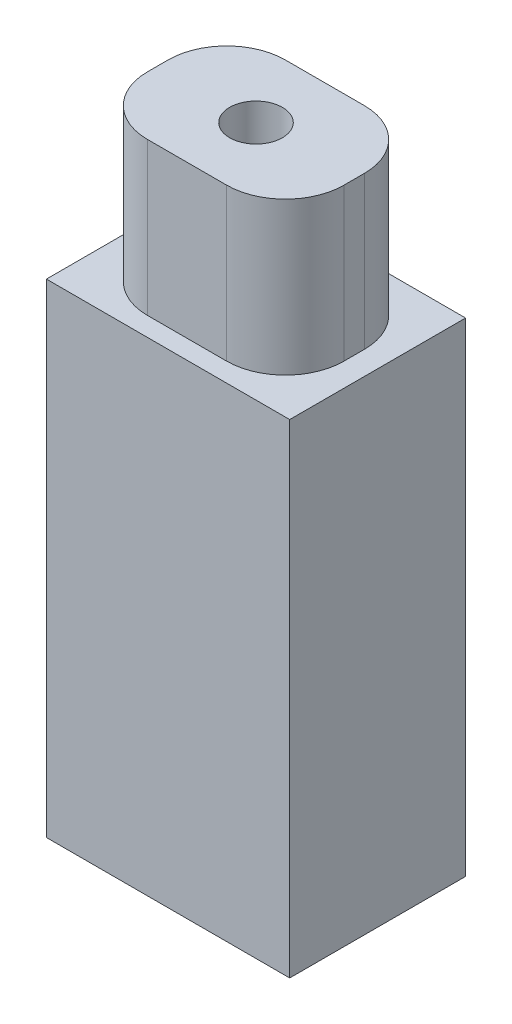
ISO-10303-21;
HEADER;
FILE_DESCRIPTION(('STEP AP214'),'2;1');
FILE_NAME('part.step','',(''),(''),'','','');
FILE_SCHEMA(('AUTOMOTIVE_DESIGN { 1 0 10303 214 1 1 1 1 }'));
ENDSEC;
DATA;
#1=APPLICATION_CONTEXT('core data for automotive mechanical design processes');
#2=APPLICATION_PROTOCOL_DEFINITION('international standard','automotive_design',2000,#1);
#3=PRODUCT_CONTEXT('',#1,'mechanical');
#4=PRODUCT('Part','Part','',(#3));
#5=PRODUCT_RELATED_PRODUCT_CATEGORY('part','',(#4));
#6=PRODUCT_DEFINITION_FORMATION('','',#4);
#7=PRODUCT_DEFINITION_CONTEXT('part definition',#1,'design');
#8=PRODUCT_DEFINITION('design','',#6,#7);
#9=PRODUCT_DEFINITION_SHAPE('','',#8);
#10=(LENGTH_UNIT() NAMED_UNIT(*) SI_UNIT(.MILLI.,.METRE.));
#11=(NAMED_UNIT(*) PLANE_ANGLE_UNIT() SI_UNIT($,.RADIAN.));
#12=(NAMED_UNIT(*) SI_UNIT($,.STERADIAN.) SOLID_ANGLE_UNIT());
#13=UNCERTAINTY_MEASURE_WITH_UNIT(LENGTH_MEASURE(1.E-05),#10,'distance_accuracy_value','');
#14=(GEOMETRIC_REPRESENTATION_CONTEXT(3) GLOBAL_UNCERTAINTY_ASSIGNED_CONTEXT((#13)) GLOBAL_UNIT_ASSIGNED_CONTEXT((#10,
#11,#12)) REPRESENTATION_CONTEXT('',''));
#15=CARTESIAN_POINT('',(0.,0.,0.));
#16=DIRECTION('',(0.,0.,1.));
#17=DIRECTION('',(1.,0.,0.));
#18=AXIS2_PLACEMENT_3D('',#15,#16,#17);
#19=CARTESIAN_POINT('',(10.541,20.955,15.24));
#20=DIRECTION('',(0.,-1.,0.));
#21=DIRECTION('',(0.,0.,-1.));
#22=AXIS2_PLACEMENT_3D('',#19,#20,#21);
#23=PLANE('',#22);
#24=DIRECTION('',(-1.,0.,0.));
#25=VECTOR('',#24,1.);
#26=CARTESIAN_POINT('',(10.541,20.955,0.));
#27=LINE('',#26,#25);
#28=CARTESIAN_POINT('',(10.541,20.955,0.));
#29=VERTEX_POINT('',#28);
#30=CARTESIAN_POINT('',(-10.541,20.955,0.));
#31=VERTEX_POINT('',#30);
#32=EDGE_CURVE('E161',#29,#31,#27,.T.);
#33=ORIENTED_EDGE('',*,*,#32,.T.);
#34=DIRECTION('',(0.,0.,-1.));
#35=VECTOR('',#34,1.);
#36=CARTESIAN_POINT('',(-10.541,20.955,15.24));
#37=LINE('',#36,#35);
#38=CARTESIAN_POINT('',(-10.541,20.955,15.24));
#39=VERTEX_POINT('',#38);
#40=EDGE_CURVE('E166',#39,#31,#37,.T.);
#41=ORIENTED_EDGE('',*,*,#40,.F.);
#42=DIRECTION('',(-1.,0.,0.));
#43=VECTOR('',#42,1.);
#44=CARTESIAN_POINT('',(10.541,20.955,15.24));
#45=LINE('',#44,#43);
#46=CARTESIAN_POINT('',(10.541,20.955,15.24));
#47=VERTEX_POINT('',#46);
#48=EDGE_CURVE('E165',#47,#39,#45,.T.);
#49=ORIENTED_EDGE('',*,*,#48,.F.);
#50=DIRECTION('',(0.,0.,-1.));
#51=VECTOR('',#50,1.);
#52=CARTESIAN_POINT('',(10.541,20.955,15.24));
#53=LINE('',#52,#51);
#54=EDGE_CURVE('E174',#47,#29,#53,.T.);
#55=ORIENTED_EDGE('',*,*,#54,.T.);
#56=EDGE_LOOP('',(#33,#41,#49,#55));
#57=FACE_BOUND('',#56,.T.);
#58=CARTESIAN_POINT('',(3.429,20.955,8.509));
#59=DIRECTION('',(0.,1.,0.));
#60=DIRECTION('',(0.,0.,1.));
#61=AXIS2_PLACEMENT_3D('',#58,#59,#60);
#62=CIRCLE('',#61,5.08);
#63=CARTESIAN_POINT('',(3.429,20.955,13.589));
#64=VERTEX_POINT('',#63);
#65=CARTESIAN_POINT('',(8.509,20.955,8.509));
#66=VERTEX_POINT('',#65);
#67=EDGE_CURVE('E54',#64,#66,#62,.T.);
#68=ORIENTED_EDGE('',*,*,#67,.F.);
#69=DIRECTION('',(1.,0.,0.));
#70=VECTOR('',#69,1.);
#71=CARTESIAN_POINT('',(3.429,20.955,13.589));
#72=LINE('',#71,#70);
#73=CARTESIAN_POINT('',(-3.429,20.955,13.589));
#74=VERTEX_POINT('',#73);
#75=EDGE_CURVE('E58',#74,#64,#72,.T.);
#76=ORIENTED_EDGE('',*,*,#75,.F.);
#77=CARTESIAN_POINT('',(-3.429,20.955,8.509));
#78=DIRECTION('',(0.,1.,0.));
#79=DIRECTION('',(0.,0.,-1.));
#80=AXIS2_PLACEMENT_3D('',#77,#78,#79);
#81=CIRCLE('',#80,5.08);
#82=CARTESIAN_POINT('',(-8.509,20.955,8.509));
#83=VERTEX_POINT('',#82);
#84=EDGE_CURVE('E286',#83,#74,#81,.T.);
#85=ORIENTED_EDGE('',*,*,#84,.F.);
#86=DIRECTION('',(0.,0.,1.));
#87=VECTOR('',#86,1.);
#88=CARTESIAN_POINT('',(-8.509,20.955,8.509));
#89=LINE('',#88,#87);
#90=CARTESIAN_POINT('',(-8.509,20.955,6.731));
#91=VERTEX_POINT('',#90);
#92=EDGE_CURVE('E283',#91,#83,#89,.T.);
#93=ORIENTED_EDGE('',*,*,#92,.F.);
#94=CARTESIAN_POINT('',(-3.429,20.955,6.731));
#95=DIRECTION('',(0.,1.,0.));
#96=DIRECTION('',(0.,0.,-1.));
#97=AXIS2_PLACEMENT_3D('',#94,#95,#96);
#98=CIRCLE('',#97,5.08);
#99=CARTESIAN_POINT('',(-3.429,20.955,1.651));
#100=VERTEX_POINT('',#99);
#101=EDGE_CURVE('E280',#100,#91,#98,.T.);
#102=ORIENTED_EDGE('',*,*,#101,.F.);
#103=DIRECTION('',(-1.,0.,0.));
#104=VECTOR('',#103,1.);
#105=CARTESIAN_POINT('',(3.429,20.955,1.651));
#106=LINE('',#105,#104);
#107=CARTESIAN_POINT('',(3.429,20.955,1.651));
#108=VERTEX_POINT('',#107);
#109=EDGE_CURVE('E277',#108,#100,#106,.T.);
#110=ORIENTED_EDGE('',*,*,#109,.F.);
#111=CARTESIAN_POINT('',(3.429,20.955,6.731));
#112=DIRECTION('',(0.,1.,0.));
#113=DIRECTION('',(0.,0.,1.));
#114=AXIS2_PLACEMENT_3D('',#111,#112,#113);
#115=CIRCLE('',#114,5.08);
#116=CARTESIAN_POINT('',(8.509,20.955,6.731));
#117=VERTEX_POINT('',#116);
#118=EDGE_CURVE('E274',#117,#108,#115,.T.);
#119=ORIENTED_EDGE('',*,*,#118,.F.);
#120=DIRECTION('',(0.,0.,-1.));
#121=VECTOR('',#120,1.);
#122=CARTESIAN_POINT('',(8.509,20.955,8.509));
#123=LINE('',#122,#121);
#124=EDGE_CURVE('E257',#66,#117,#123,.T.);
#125=ORIENTED_EDGE('',*,*,#124,.F.);
#126=EDGE_LOOP('',(#68,#76,#85,#93,#102,#110,#119,#125));
#127=FACE_BOUND('',#126,.T.);
#128=ADVANCED_FACE('F39',(#57,#127),#23,.F.);
#129=CARTESIAN_POINT('',(-10.541,-20.955,15.24));
#130=DIRECTION('',(1.,0.,0.));
#131=DIRECTION('',(0.,0.,-1.));
#132=AXIS2_PLACEMENT_3D('',#129,#130,#131);
#133=PLANE('',#132);
#134=DIRECTION('',(0.,-1.,0.));
#135=VECTOR('',#134,1.);
#136=CARTESIAN_POINT('',(-10.541,-20.955,0.));
#137=LINE('',#136,#135);
#138=CARTESIAN_POINT('',(-10.541,-20.955,0.));
#139=VERTEX_POINT('',#138);
#140=EDGE_CURVE('E148',#31,#139,#137,.T.);
#141=ORIENTED_EDGE('',*,*,#140,.T.);
#142=DIRECTION('',(0.,0.,-1.));
#143=VECTOR('',#142,1.);
#144=CARTESIAN_POINT('',(-10.541,-20.955,15.24));
#145=LINE('',#144,#143);
#146=CARTESIAN_POINT('',(-10.541,-20.955,15.24));
#147=VERTEX_POINT('',#146);
#148=EDGE_CURVE('E11',#147,#139,#145,.T.);
#149=ORIENTED_EDGE('',*,*,#148,.F.);
#150=DIRECTION('',(0.,-1.,0.));
#151=VECTOR('',#150,1.);
#152=CARTESIAN_POINT('',(-10.541,-20.955,15.24));
#153=LINE('',#152,#151);
#154=EDGE_CURVE('E157',#39,#147,#153,.T.);
#155=ORIENTED_EDGE('',*,*,#154,.F.);
#156=ORIENTED_EDGE('',*,*,#40,.T.);
#157=EDGE_LOOP('',(#141,#149,#155,#156));
#158=FACE_BOUND('',#157,.T.);
#159=ADVANCED_FACE('F41',(#158),#133,.F.);
#160=CARTESIAN_POINT('',(10.541,-20.955,15.24));
#161=DIRECTION('',(0.,1.,0.));
#162=DIRECTION('',(-1.,0.,0.));
#163=AXIS2_PLACEMENT_3D('',#160,#161,#162);
#164=PLANE('',#163);
#165=DIRECTION('',(1.,0.,0.));
#166=VECTOR('',#165,1.);
#167=CARTESIAN_POINT('',(10.541,-20.955,0.));
#168=LINE('',#167,#166);
#169=CARTESIAN_POINT('',(10.541,-20.955,0.));
#170=VERTEX_POINT('',#169);
#171=EDGE_CURVE('E151',#139,#170,#168,.T.);
#172=ORIENTED_EDGE('',*,*,#171,.T.);
#173=DIRECTION('',(0.,0.,-1.));
#174=VECTOR('',#173,1.);
#175=CARTESIAN_POINT('',(10.541,-20.955,15.24));
#176=LINE('',#175,#174);
#177=CARTESIAN_POINT('',(10.541,-20.955,15.24));
#178=VERTEX_POINT('',#177);
#179=EDGE_CURVE('E47',#178,#170,#176,.T.);
#180=ORIENTED_EDGE('',*,*,#179,.F.);
#181=DIRECTION('',(1.,0.,0.));
#182=VECTOR('',#181,1.);
#183=CARTESIAN_POINT('',(10.541,-20.955,15.24));
#184=LINE('',#183,#182);
#185=EDGE_CURVE('E160',#147,#178,#184,.T.);
#186=ORIENTED_EDGE('',*,*,#185,.F.);
#187=ORIENTED_EDGE('',*,*,#148,.T.);
#188=EDGE_LOOP('',(#172,#180,#186,#187));
#189=FACE_BOUND('',#188,.T.);
#190=ADVANCED_FACE('F196',(#189),#164,.F.);
#191=CARTESIAN_POINT('',(10.541,-20.955,15.24));
#192=DIRECTION('',(-1.,0.,0.));
#193=DIRECTION('',(0.,0.,1.));
#194=AXIS2_PLACEMENT_3D('',#191,#192,#193);
#195=PLANE('',#194);
#196=DIRECTION('',(0.,1.,0.));
#197=VECTOR('',#196,1.);
#198=CARTESIAN_POINT('',(10.541,-20.955,0.));
#199=LINE('',#198,#197);
#200=EDGE_CURVE('E169',#170,#29,#199,.T.);
#201=ORIENTED_EDGE('',*,*,#200,.T.);
#202=ORIENTED_EDGE('',*,*,#54,.F.);
#203=DIRECTION('',(0.,1.,0.));
#204=VECTOR('',#203,1.);
#205=CARTESIAN_POINT('',(10.541,-20.955,15.24));
#206=LINE('',#205,#204);
#207=EDGE_CURVE('E163',#178,#47,#206,.T.);
#208=ORIENTED_EDGE('',*,*,#207,.F.);
#209=ORIENTED_EDGE('',*,*,#179,.T.);
#210=EDGE_LOOP('',(#201,#202,#208,#209));
#211=FACE_BOUND('',#210,.T.);
#212=ADVANCED_FACE('F181',(#211),#195,.F.);
#213=CARTESIAN_POINT('',(0.,0.,15.24));
#214=DIRECTION('',(0.,0.,1.));
#215=DIRECTION('',(1.,0.,0.));
#216=AXIS2_PLACEMENT_3D('',#213,#214,#215);
#217=PLANE('',#216);
#218=ORIENTED_EDGE('',*,*,#154,.T.);
#219=ORIENTED_EDGE('',*,*,#185,.T.);
#220=ORIENTED_EDGE('',*,*,#207,.T.);
#221=ORIENTED_EDGE('',*,*,#48,.T.);
#222=EDGE_LOOP('',(#218,#219,#220,#221));
#223=FACE_BOUND('',#222,.T.);
#224=ADVANCED_FACE('F195',(#223),#217,.T.);
#225=CARTESIAN_POINT('',(0.,0.,0.));
#226=DIRECTION('',(0.,0.,1.));
#227=DIRECTION('',(1.,0.,0.));
#228=AXIS2_PLACEMENT_3D('',#225,#226,#227);
#229=PLANE('',#228);
#230=ORIENTED_EDGE('',*,*,#140,.F.);
#231=ORIENTED_EDGE('',*,*,#32,.F.);
#232=ORIENTED_EDGE('',*,*,#200,.F.);
#233=ORIENTED_EDGE('',*,*,#171,.F.);
#234=EDGE_LOOP('',(#230,#231,#232,#233));
#235=FACE_BOUND('',#234,.T.);
#236=ADVANCED_FACE('F187',(#235),#229,.F.);
#237=CARTESIAN_POINT('',(3.429,34.163,8.509));
#238=DIRECTION('',(0.,-1.,0.));
#239=DIRECTION('',(0.,0.,-1.));
#240=AXIS2_PLACEMENT_3D('',#237,#238,#239);
#241=CYLINDRICAL_SURFACE('',#240,5.08);
#242=ORIENTED_EDGE('',*,*,#67,.T.);
#243=DIRECTION('',(0.,-1.,0.));
#244=VECTOR('',#243,1.);
#245=CARTESIAN_POINT('',(8.509,34.163,8.509));
#246=LINE('',#245,#244);
#247=CARTESIAN_POINT('',(8.509,34.163,8.509));
#248=VERTEX_POINT('',#247);
#249=EDGE_CURVE('E131',#248,#66,#246,.T.);
#250=ORIENTED_EDGE('',*,*,#249,.F.);
#251=CARTESIAN_POINT('',(3.429,34.163,8.509));
#252=DIRECTION('',(0.,1.,0.));
#253=DIRECTION('',(0.,0.,1.));
#254=AXIS2_PLACEMENT_3D('',#251,#252,#253);
#255=CIRCLE('',#254,5.08);
#256=CARTESIAN_POINT('',(3.429,34.163,13.589));
#257=VERTEX_POINT('',#256);
#258=EDGE_CURVE('E137',#257,#248,#255,.T.);
#259=ORIENTED_EDGE('',*,*,#258,.F.);
#260=DIRECTION('',(0.,-1.,0.));
#261=VECTOR('',#260,1.);
#262=CARTESIAN_POINT('',(3.429,34.163,13.589));
#263=LINE('',#262,#261);
#264=EDGE_CURVE('E271',#257,#64,#263,.T.);
#265=ORIENTED_EDGE('',*,*,#264,.T.);
#266=EDGE_LOOP('',(#242,#250,#259,#265));
#267=FACE_BOUND('',#266,.T.);
#268=ADVANCED_FACE('F147',(#267),#241,.T.);
#269=CARTESIAN_POINT('',(8.509,34.163,8.509));
#270=DIRECTION('',(-1.,0.,0.));
#271=DIRECTION('',(0.,0.,1.));
#272=AXIS2_PLACEMENT_3D('',#269,#270,#271);
#273=PLANE('',#272);
#274=ORIENTED_EDGE('',*,*,#124,.T.);
#275=DIRECTION('',(0.,-1.,0.));
#276=VECTOR('',#275,1.);
#277=CARTESIAN_POINT('',(8.509,34.163,6.731));
#278=LINE('',#277,#276);
#279=CARTESIAN_POINT('',(8.509,34.163,6.731));
#280=VERTEX_POINT('',#279);
#281=EDGE_CURVE('E133',#280,#117,#278,.T.);
#282=ORIENTED_EDGE('',*,*,#281,.F.);
#283=DIRECTION('',(0.,0.,-1.));
#284=VECTOR('',#283,1.);
#285=CARTESIAN_POINT('',(8.509,34.163,8.509));
#286=LINE('',#285,#284);
#287=EDGE_CURVE('E126',#248,#280,#286,.T.);
#288=ORIENTED_EDGE('',*,*,#287,.F.);
#289=ORIENTED_EDGE('',*,*,#249,.T.);
#290=EDGE_LOOP('',(#274,#282,#288,#289));
#291=FACE_BOUND('',#290,.T.);
#292=ADVANCED_FACE('F129',(#291),#273,.F.);
#293=CARTESIAN_POINT('',(3.429,34.163,6.731));
#294=DIRECTION('',(0.,-1.,0.));
#295=DIRECTION('',(0.,0.,-1.));
#296=AXIS2_PLACEMENT_3D('',#293,#294,#295);
#297=CYLINDRICAL_SURFACE('',#296,5.08);
#298=ORIENTED_EDGE('',*,*,#118,.T.);
#299=DIRECTION('',(0.,-1.,0.));
#300=VECTOR('',#299,1.);
#301=CARTESIAN_POINT('',(3.429,34.163,1.651));
#302=LINE('',#301,#300);
#303=CARTESIAN_POINT('',(3.429,34.163,1.651));
#304=VERTEX_POINT('',#303);
#305=EDGE_CURVE('E153',#304,#108,#302,.T.);
#306=ORIENTED_EDGE('',*,*,#305,.F.);
#307=CARTESIAN_POINT('',(3.429,34.163,6.731));
#308=DIRECTION('',(0.,1.,0.));
#309=DIRECTION('',(0.,0.,1.));
#310=AXIS2_PLACEMENT_3D('',#307,#308,#309);
#311=CIRCLE('',#310,5.08);
#312=EDGE_CURVE('E136',#280,#304,#311,.T.);
#313=ORIENTED_EDGE('',*,*,#312,.F.);
#314=ORIENTED_EDGE('',*,*,#281,.T.);
#315=EDGE_LOOP('',(#298,#306,#313,#314));
#316=FACE_BOUND('',#315,.T.);
#317=ADVANCED_FACE('F216',(#316),#297,.T.);
#318=CARTESIAN_POINT('',(3.429,34.163,1.651));
#319=DIRECTION('',(0.,0.,1.));
#320=DIRECTION('',(1.,0.,0.));
#321=AXIS2_PLACEMENT_3D('',#318,#319,#320);
#322=PLANE('',#321);
#323=ORIENTED_EDGE('',*,*,#109,.T.);
#324=DIRECTION('',(0.,-1.,0.));
#325=VECTOR('',#324,1.);
#326=CARTESIAN_POINT('',(-3.429,34.163,1.651));
#327=LINE('',#326,#325);
#328=CARTESIAN_POINT('',(-3.429,34.163,1.651));
#329=VERTEX_POINT('',#328);
#330=EDGE_CURVE('E299',#329,#100,#327,.T.);
#331=ORIENTED_EDGE('',*,*,#330,.F.);
#332=DIRECTION('',(-1.,0.,0.));
#333=VECTOR('',#332,1.);
#334=CARTESIAN_POINT('',(3.429,34.163,1.651));
#335=LINE('',#334,#333);
#336=EDGE_CURVE('E263',#304,#329,#335,.T.);
#337=ORIENTED_EDGE('',*,*,#336,.F.);
#338=ORIENTED_EDGE('',*,*,#305,.T.);
#339=EDGE_LOOP('',(#323,#331,#337,#338));
#340=FACE_BOUND('',#339,.T.);
#341=ADVANCED_FACE('F219',(#340),#322,.F.);
#342=CARTESIAN_POINT('',(-3.429,34.163,6.731));
#343=DIRECTION('',(0.,-1.,0.));
#344=DIRECTION('',(0.,0.,-1.));
#345=AXIS2_PLACEMENT_3D('',#342,#343,#344);
#346=CYLINDRICAL_SURFACE('',#345,5.08);
#347=ORIENTED_EDGE('',*,*,#101,.T.);
#348=DIRECTION('',(0.,-1.,0.));
#349=VECTOR('',#348,1.);
#350=CARTESIAN_POINT('',(-8.509,34.163,6.731));
#351=LINE('',#350,#349);
#352=CARTESIAN_POINT('',(-8.509,34.163,6.731));
#353=VERTEX_POINT('',#352);
#354=EDGE_CURVE('E296',#353,#91,#351,.T.);
#355=ORIENTED_EDGE('',*,*,#354,.F.);
#356=CARTESIAN_POINT('',(-3.429,34.163,6.731));
#357=DIRECTION('',(0.,1.,0.));
#358=DIRECTION('',(0.,0.,-1.));
#359=AXIS2_PLACEMENT_3D('',#356,#357,#358);
#360=CIRCLE('',#359,5.08);
#361=EDGE_CURVE('E265',#329,#353,#360,.T.);
#362=ORIENTED_EDGE('',*,*,#361,.F.);
#363=ORIENTED_EDGE('',*,*,#330,.T.);
#364=EDGE_LOOP('',(#347,#355,#362,#363));
#365=FACE_BOUND('',#364,.T.);
#366=ADVANCED_FACE('F223',(#365),#346,.T.);
#367=CARTESIAN_POINT('',(-8.509,34.163,8.509));
#368=DIRECTION('',(1.,0.,0.));
#369=DIRECTION('',(0.,0.,-1.));
#370=AXIS2_PLACEMENT_3D('',#367,#368,#369);
#371=PLANE('',#370);
#372=ORIENTED_EDGE('',*,*,#92,.T.);
#373=DIRECTION('',(0.,-1.,0.));
#374=VECTOR('',#373,1.);
#375=CARTESIAN_POINT('',(-8.509,34.163,8.509));
#376=LINE('',#375,#374);
#377=CARTESIAN_POINT('',(-8.509,34.163,8.509));
#378=VERTEX_POINT('',#377);
#379=EDGE_CURVE('E293',#378,#83,#376,.T.);
#380=ORIENTED_EDGE('',*,*,#379,.F.);
#381=DIRECTION('',(0.,0.,1.));
#382=VECTOR('',#381,1.);
#383=CARTESIAN_POINT('',(-8.509,34.163,8.509));
#384=LINE('',#383,#382);
#385=EDGE_CURVE('E267',#353,#378,#384,.T.);
#386=ORIENTED_EDGE('',*,*,#385,.F.);
#387=ORIENTED_EDGE('',*,*,#354,.T.);
#388=EDGE_LOOP('',(#372,#380,#386,#387));
#389=FACE_BOUND('',#388,.T.);
#390=ADVANCED_FACE('F227',(#389),#371,.F.);
#391=CARTESIAN_POINT('',(-3.429,34.163,8.509));
#392=DIRECTION('',(0.,-1.,0.));
#393=DIRECTION('',(0.,0.,-1.));
#394=AXIS2_PLACEMENT_3D('',#391,#392,#393);
#395=CYLINDRICAL_SURFACE('',#394,5.08);
#396=ORIENTED_EDGE('',*,*,#84,.T.);
#397=DIRECTION('',(0.,-1.,0.));
#398=VECTOR('',#397,1.);
#399=CARTESIAN_POINT('',(-3.429,34.163,13.589));
#400=LINE('',#399,#398);
#401=CARTESIAN_POINT('',(-3.429,34.163,13.589));
#402=VERTEX_POINT('',#401);
#403=EDGE_CURVE('E290',#402,#74,#400,.T.);
#404=ORIENTED_EDGE('',*,*,#403,.F.);
#405=CARTESIAN_POINT('',(-3.429,34.163,8.509));
#406=DIRECTION('',(0.,1.,0.));
#407=DIRECTION('',(0.,0.,-1.));
#408=AXIS2_PLACEMENT_3D('',#405,#406,#407);
#409=CIRCLE('',#408,5.08);
#410=EDGE_CURVE('E269',#378,#402,#409,.T.);
#411=ORIENTED_EDGE('',*,*,#410,.F.);
#412=ORIENTED_EDGE('',*,*,#379,.T.);
#413=EDGE_LOOP('',(#396,#404,#411,#412));
#414=FACE_BOUND('',#413,.T.);
#415=ADVANCED_FACE('F231',(#414),#395,.T.);
#416=CARTESIAN_POINT('',(3.429,34.163,13.589));
#417=DIRECTION('',(0.,0.,-1.));
#418=DIRECTION('',(-1.,0.,0.));
#419=AXIS2_PLACEMENT_3D('',#416,#417,#418);
#420=PLANE('',#419);
#421=ORIENTED_EDGE('',*,*,#75,.T.);
#422=ORIENTED_EDGE('',*,*,#264,.F.);
#423=DIRECTION('',(1.,0.,0.));
#424=VECTOR('',#423,1.);
#425=CARTESIAN_POINT('',(3.429,34.163,13.589));
#426=LINE('',#425,#424);
#427=EDGE_CURVE('E142',#402,#257,#426,.T.);
#428=ORIENTED_EDGE('',*,*,#427,.F.);
#429=ORIENTED_EDGE('',*,*,#403,.T.);
#430=EDGE_LOOP('',(#421,#422,#428,#429));
#431=FACE_BOUND('',#430,.T.);
#432=ADVANCED_FACE('F235',(#431),#420,.F.);
#433=CARTESIAN_POINT('',(3.429,34.163,8.509));
#434=DIRECTION('',(0.,1.,0.));
#435=DIRECTION('',(0.,0.,1.));
#436=AXIS2_PLACEMENT_3D('',#433,#434,#435);
#437=PLANE('',#436);
#438=CARTESIAN_POINT('',(0.,34.163,7.62));
#439=DIRECTION('',(0.,1.,0.));
#440=DIRECTION('',(0.,0.,1.));
#441=AXIS2_PLACEMENT_3D('',#438,#439,#440);
#442=CIRCLE('',#441,2.286);
#443=CARTESIAN_POINT('',(0.,34.163,9.906));
#444=VERTEX_POINT('',#443);
#445=EDGE_CURVE('E255',#444,#444,#442,.T.);
#446=ORIENTED_EDGE('',*,*,#445,.F.);
#447=EDGE_LOOP('',(#446));
#448=FACE_BOUND('',#447,.T.);
#449=ORIENTED_EDGE('',*,*,#258,.T.);
#450=ORIENTED_EDGE('',*,*,#287,.T.);
#451=ORIENTED_EDGE('',*,*,#312,.T.);
#452=ORIENTED_EDGE('',*,*,#336,.T.);
#453=ORIENTED_EDGE('',*,*,#361,.T.);
#454=ORIENTED_EDGE('',*,*,#385,.T.);
#455=ORIENTED_EDGE('',*,*,#410,.T.);
#456=ORIENTED_EDGE('',*,*,#427,.T.);
#457=EDGE_LOOP('',(#449,#450,#451,#452,#453,#454,#455,#456));
#458=FACE_BOUND('',#457,.T.);
#459=ADVANCED_FACE('F140',(#448,#458),#437,.T.);
#460=CARTESIAN_POINT('',(0.,24.003,7.62));
#461=DIRECTION('',(0.,1.,0.));
#462=DIRECTION('',(0.,0.,1.));
#463=AXIS2_PLACEMENT_3D('',#460,#461,#462);
#464=CYLINDRICAL_SURFACE('',#463,2.286);
#465=CARTESIAN_POINT('',(0.,24.003,7.62));
#466=DIRECTION('',(0.,1.,0.));
#467=DIRECTION('',(0.,0.,1.));
#468=AXIS2_PLACEMENT_3D('',#465,#466,#467);
#469=CIRCLE('',#468,2.286);
#470=CARTESIAN_POINT('',(0.,24.003,9.906));
#471=VERTEX_POINT('',#470);
#472=EDGE_CURVE('E254',#471,#471,#469,.T.);
#473=ORIENTED_EDGE('',*,*,#472,.F.);
#474=EDGE_LOOP('',(#473));
#475=FACE_BOUND('',#474,.T.);
#476=ORIENTED_EDGE('',*,*,#445,.T.);
#477=EDGE_LOOP('',(#476));
#478=FACE_BOUND('',#477,.T.);
#479=ADVANCED_FACE('F242',(#475,#478),#464,.F.);
#480=CARTESIAN_POINT('',(0.,24.003,7.62));
#481=DIRECTION('',(0.,1.,0.));
#482=DIRECTION('',(0.,0.,1.));
#483=AXIS2_PLACEMENT_3D('',#480,#481,#482);
#484=PLANE('',#483);
#485=ORIENTED_EDGE('',*,*,#472,.T.);
#486=EDGE_LOOP('',(#485));
#487=FACE_BOUND('',#486,.T.);
#488=ADVANCED_FACE('F246',(#487),#484,.T.);
#489=CLOSED_SHELL('',(#128,#159,#190,#212,#224,#236,#268,#292,#317,#341,#366,#390,#415,#432,
#459,#479,#488));
#490=MANIFOLD_SOLID_BREP('B2',#489);
#491=ADVANCED_BREP_SHAPE_REPRESENTATION('',(#18,#490),#14);
#492=SHAPE_DEFINITION_REPRESENTATION(#9,#491);
ENDSEC;
END-ISO-10303-21;
